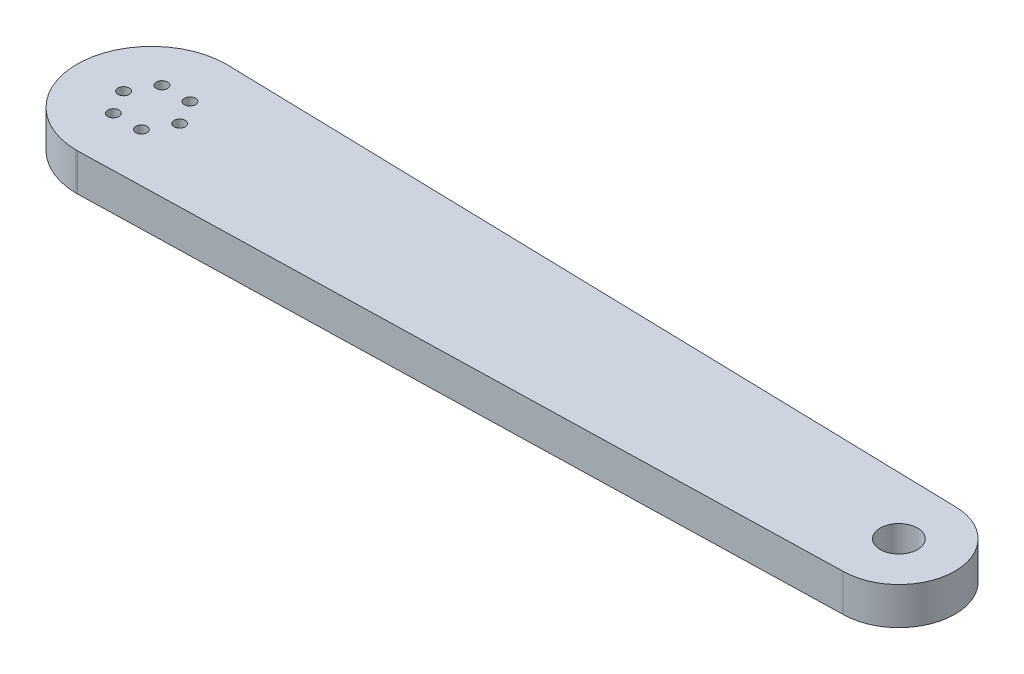
ISO-10303-21;
HEADER;
FILE_DESCRIPTION(('STEP AP214'),'2;1');
FILE_NAME('part.step','',(''),(''),'','','');
FILE_SCHEMA(('AUTOMOTIVE_DESIGN { 1 0 10303 214 1 1 1 1 }'));
ENDSEC;
DATA;
#1=APPLICATION_CONTEXT('core data for automotive mechanical design processes');
#2=APPLICATION_PROTOCOL_DEFINITION('international standard','automotive_design',2000,#1);
#3=PRODUCT_CONTEXT('',#1,'mechanical');
#4=PRODUCT('Part','Part','',(#3));
#5=PRODUCT_RELATED_PRODUCT_CATEGORY('part','',(#4));
#6=PRODUCT_DEFINITION_FORMATION('','',#4);
#7=PRODUCT_DEFINITION_CONTEXT('part definition',#1,'design');
#8=PRODUCT_DEFINITION('design','',#6,#7);
#9=PRODUCT_DEFINITION_SHAPE('','',#8);
#10=(LENGTH_UNIT() NAMED_UNIT(*) SI_UNIT(.MILLI.,.METRE.));
#11=(NAMED_UNIT(*) PLANE_ANGLE_UNIT() SI_UNIT($,.RADIAN.));
#12=(NAMED_UNIT(*) SI_UNIT($,.STERADIAN.) SOLID_ANGLE_UNIT());
#13=UNCERTAINTY_MEASURE_WITH_UNIT(LENGTH_MEASURE(1.E-05),#10,'distance_accuracy_value','');
#14=(GEOMETRIC_REPRESENTATION_CONTEXT(3) GLOBAL_UNCERTAINTY_ASSIGNED_CONTEXT((#13)) GLOBAL_UNIT_ASSIGNED_CONTEXT((#10,
#11,#12)) REPRESENTATION_CONTEXT('',''));
#15=CARTESIAN_POINT('',(0.,0.,0.));
#16=DIRECTION('',(0.,0.,1.));
#17=DIRECTION('',(1.,0.,0.));
#18=AXIS2_PLACEMENT_3D('',#15,#16,#17);
#19=CARTESIAN_POINT('',(-0.103539177595322,10.,9.99946396756861));
#20=DIRECTION('',(0.,-1.,0.));
#21=DIRECTION('',(0.,0.,-1.));
#22=AXIS2_PLACEMENT_3D('',#19,#20,#21);
#23=PLANE('',#22);
#24=CARTESIAN_POINT('',(-0.103539177595322,10.,9.99946396756861));
#25=DIRECTION('',(0.,1.,0.));
#26=DIRECTION('',(0.,0.,-1.));
#27=AXIS2_PLACEMENT_3D('',#24,#25,#26);
#28=CIRCLE('',#27,9.99999999999999);
#29=CARTESIAN_POINT('',(-0.207078355190655,10.,19.9989279351372));
#30=VERTEX_POINT('',#29);
#31=CARTESIAN_POINT('',(0.146382734006708,10.,19.9963404316498));
#32=VERTEX_POINT('',#31);
#33=EDGE_CURVE('E129',#30,#32,#28,.T.);
#34=ORIENTED_EDGE('',*,*,#33,.T.);
#35=DIRECTION('',(0.999687646408123,0.,-0.0249921911602031));
#36=VECTOR('',#35,1.);
#37=CARTESIAN_POINT('',(0.146382734006708,10.,19.9963404316498));
#38=LINE('',#37,#36);
#39=CARTESIAN_POINT('',(200.,10.,15.));
#40=VERTEX_POINT('',#39);
#41=EDGE_CURVE('E87',#32,#40,#38,.T.);
#42=ORIENTED_EDGE('',*,*,#41,.T.);
#43=CARTESIAN_POINT('',(200.,10.,0.));
#44=DIRECTION('',(0.,1.,0.));
#45=DIRECTION('',(0.,0.,1.));
#46=AXIS2_PLACEMENT_3D('',#43,#44,#45);
#47=CIRCLE('',#46,15.);
#48=CARTESIAN_POINT('',(200.,10.,-15.));
#49=VERTEX_POINT('',#48);
#50=EDGE_CURVE('E100',#40,#49,#47,.T.);
#51=ORIENTED_EDGE('',*,*,#50,.T.);
#52=DIRECTION('',(-0.999687646408123,0.,-0.0249921911602031));
#53=VECTOR('',#52,1.);
#54=CARTESIAN_POINT('',(0.146382734006708,10.,-19.9963404316498));
#55=LINE('',#54,#53);
#56=CARTESIAN_POINT('',(0.146382734006708,10.,-19.9963404316498));
#57=VERTEX_POINT('',#56);
#58=EDGE_CURVE('E94',#49,#57,#55,.T.);
#59=ORIENTED_EDGE('',*,*,#58,.T.);
#60=CARTESIAN_POINT('',(-0.103539177595322,10.,-9.99946396756861));
#61=DIRECTION('',(0.,1.,0.));
#62=DIRECTION('',(0.,0.,1.));
#63=AXIS2_PLACEMENT_3D('',#60,#61,#62);
#64=CIRCLE('',#63,9.99999999999999);
#65=CARTESIAN_POINT('',(-0.207078355190642,10.,-19.9989279351372));
#66=VERTEX_POINT('',#65);
#67=EDGE_CURVE('E98',#57,#66,#64,.T.);
#68=ORIENTED_EDGE('',*,*,#67,.T.);
#69=CARTESIAN_POINT('',(0.,10.,0.));
#70=DIRECTION('',(0.,1.,0.));
#71=DIRECTION('',(0.,0.,1.));
#72=AXIS2_PLACEMENT_3D('',#69,#70,#71);
#73=CIRCLE('',#72,20.);
#74=EDGE_CURVE('E50',#66,#30,#73,.T.);
#75=ORIENTED_EDGE('',*,*,#74,.T.);
#76=EDGE_LOOP('',(#34,#42,#51,#59,#68,#75));
#77=FACE_BOUND('',#76,.T.);
#78=CARTESIAN_POINT('',(7.5,10.,0.));
#79=DIRECTION('',(0.,1.,0.));
#80=DIRECTION('',(0.,0.,1.));
#81=AXIS2_PLACEMENT_3D('',#78,#79,#80);
#82=CIRCLE('',#81,1.5);
#83=CARTESIAN_POINT('',(7.5,10.,1.5));
#84=VERTEX_POINT('',#83);
#85=EDGE_CURVE('E122',#84,#84,#82,.T.);
#86=ORIENTED_EDGE('',*,*,#85,.F.);
#87=EDGE_LOOP('',(#86));
#88=FACE_BOUND('',#87,.T.);
#89=CARTESIAN_POINT('',(200.,10.,0.));
#90=DIRECTION('',(0.,1.,0.));
#91=DIRECTION('',(0.,0.,1.));
#92=AXIS2_PLACEMENT_3D('',#89,#90,#91);
#93=CIRCLE('',#92,4.99999999999999);
#94=CARTESIAN_POINT('',(200.,10.,4.99999999999999));
#95=VERTEX_POINT('',#94);
#96=EDGE_CURVE('E223',#95,#95,#93,.T.);
#97=ORIENTED_EDGE('',*,*,#96,.F.);
#98=EDGE_LOOP('',(#97));
#99=FACE_BOUND('',#98,.T.);
#100=CARTESIAN_POINT('',(3.74999999999998,10.,6.4951905283833));
#101=DIRECTION('',(0.,1.,0.));
#102=DIRECTION('',(0.,0.,1.));
#103=AXIS2_PLACEMENT_3D('',#100,#101,#102);
#104=CIRCLE('',#103,1.5);
#105=CARTESIAN_POINT('',(3.74999999999998,10.,7.9951905283833));
#106=VERTEX_POINT('',#105);
#107=EDGE_CURVE('E217',#106,#106,#104,.T.);
#108=ORIENTED_EDGE('',*,*,#107,.F.);
#109=EDGE_LOOP('',(#108));
#110=FACE_BOUND('',#109,.T.);
#111=CARTESIAN_POINT('',(-3.75000000000003,10.,6.49519052838327));
#112=DIRECTION('',(0.,1.,0.));
#113=DIRECTION('',(0.,0.,1.));
#114=AXIS2_PLACEMENT_3D('',#111,#112,#113);
#115=CIRCLE('',#114,1.5);
#116=CARTESIAN_POINT('',(-3.75000000000003,10.,7.99519052838327));
#117=VERTEX_POINT('',#116);
#118=EDGE_CURVE('E211',#117,#117,#115,.T.);
#119=ORIENTED_EDGE('',*,*,#118,.F.);
#120=EDGE_LOOP('',(#119));
#121=FACE_BOUND('',#120,.T.);
#122=CARTESIAN_POINT('',(-7.5,10.,0.));
#123=DIRECTION('',(0.,1.,0.));
#124=DIRECTION('',(0.,0.,1.));
#125=AXIS2_PLACEMENT_3D('',#122,#123,#124);
#126=CIRCLE('',#125,1.5);
#127=CARTESIAN_POINT('',(-7.5,10.,1.49999999999995));
#128=VERTEX_POINT('',#127);
#129=EDGE_CURVE('E205',#128,#128,#126,.T.);
#130=ORIENTED_EDGE('',*,*,#129,.F.);
#131=EDGE_LOOP('',(#130));
#132=FACE_BOUND('',#131,.T.);
#133=CARTESIAN_POINT('',(-3.74999999999994,10.,-6.49519052838333));
#134=DIRECTION('',(0.,1.,0.));
#135=DIRECTION('',(0.,0.,1.));
#136=AXIS2_PLACEMENT_3D('',#133,#134,#135);
#137=CIRCLE('',#136,1.5);
#138=CARTESIAN_POINT('',(-3.74999999999994,10.,-4.99519052838333));
#139=VERTEX_POINT('',#138);
#140=EDGE_CURVE('E199',#139,#139,#137,.T.);
#141=ORIENTED_EDGE('',*,*,#140,.F.);
#142=EDGE_LOOP('',(#141));
#143=FACE_BOUND('',#142,.T.);
#144=CARTESIAN_POINT('',(3.75000000000008,10.,-6.49519052838325));
#145=DIRECTION('',(0.,1.,0.));
#146=DIRECTION('',(0.,0.,1.));
#147=AXIS2_PLACEMENT_3D('',#144,#145,#146);
#148=CIRCLE('',#147,1.5);
#149=CARTESIAN_POINT('',(3.75000000000008,10.,-4.99519052838325));
#150=VERTEX_POINT('',#149);
#151=EDGE_CURVE('E190',#150,#150,#148,.T.);
#152=ORIENTED_EDGE('',*,*,#151,.F.);
#153=EDGE_LOOP('',(#152));
#154=FACE_BOUND('',#153,.T.);
#155=ADVANCED_FACE('F33',(#77,#88,#99,#110,#121,#132,#143,#154),#23,.F.);
#156=CARTESIAN_POINT('',(-0.103539177595322,0.,9.99946396756861));
#157=DIRECTION('',(0.,-1.,0.));
#158=DIRECTION('',(0.,0.,-1.));
#159=AXIS2_PLACEMENT_3D('',#156,#157,#158);
#160=PLANE('',#159);
#161=CARTESIAN_POINT('',(-3.74999999999994,0.,-6.49519052838333));
#162=DIRECTION('',(0.,1.,0.));
#163=DIRECTION('',(0.,0.,1.));
#164=AXIS2_PLACEMENT_3D('',#161,#162,#163);
#165=CIRCLE('',#164,1.5);
#166=CARTESIAN_POINT('',(-3.74999999999994,0.,-4.99519052838333));
#167=VERTEX_POINT('',#166);
#168=EDGE_CURVE('E196',#167,#167,#165,.T.);
#169=ORIENTED_EDGE('',*,*,#168,.T.);
#170=EDGE_LOOP('',(#169));
#171=FACE_BOUND('',#170,.T.);
#172=CARTESIAN_POINT('',(-3.75000000000003,0.,6.49519052838327));
#173=DIRECTION('',(0.,1.,0.));
#174=DIRECTION('',(0.,0.,1.));
#175=AXIS2_PLACEMENT_3D('',#172,#173,#174);
#176=CIRCLE('',#175,1.5);
#177=CARTESIAN_POINT('',(-3.75000000000003,0.,7.99519052838327));
#178=VERTEX_POINT('',#177);
#179=EDGE_CURVE('E208',#178,#178,#176,.T.);
#180=ORIENTED_EDGE('',*,*,#179,.T.);
#181=EDGE_LOOP('',(#180));
#182=FACE_BOUND('',#181,.T.);
#183=CARTESIAN_POINT('',(200.,0.,0.));
#184=DIRECTION('',(0.,1.,0.));
#185=DIRECTION('',(0.,0.,1.));
#186=AXIS2_PLACEMENT_3D('',#183,#184,#185);
#187=CIRCLE('',#186,4.99999999999999);
#188=CARTESIAN_POINT('',(200.,0.,4.99999999999999));
#189=VERTEX_POINT('',#188);
#190=EDGE_CURVE('E220',#189,#189,#187,.T.);
#191=ORIENTED_EDGE('',*,*,#190,.T.);
#192=EDGE_LOOP('',(#191));
#193=FACE_BOUND('',#192,.T.);
#194=CARTESIAN_POINT('',(-0.103539177595322,0.,9.99946396756861));
#195=DIRECTION('',(0.,1.,0.));
#196=DIRECTION('',(0.,0.,-1.));
#197=AXIS2_PLACEMENT_3D('',#194,#195,#196);
#198=CIRCLE('',#197,9.99999999999999);
#199=CARTESIAN_POINT('',(-0.207078355190655,0.,19.9989279351372));
#200=VERTEX_POINT('',#199);
#201=CARTESIAN_POINT('',(0.146382734006708,0.,19.9963404316498));
#202=VERTEX_POINT('',#201);
#203=EDGE_CURVE('E118',#200,#202,#198,.T.);
#204=ORIENTED_EDGE('',*,*,#203,.F.);
#205=CARTESIAN_POINT('',(0.,0.,0.));
#206=DIRECTION('',(0.,1.,0.));
#207=DIRECTION('',(0.,0.,1.));
#208=AXIS2_PLACEMENT_3D('',#205,#206,#207);
#209=CIRCLE('',#208,20.);
#210=CARTESIAN_POINT('',(-0.207078355190642,0.,-19.9989279351372));
#211=VERTEX_POINT('',#210);
#212=EDGE_CURVE('E79',#211,#200,#209,.T.);
#213=ORIENTED_EDGE('',*,*,#212,.F.);
#214=CARTESIAN_POINT('',(-0.103539177595322,0.,-9.99946396756861));
#215=DIRECTION('',(0.,1.,0.));
#216=DIRECTION('',(0.,0.,1.));
#217=AXIS2_PLACEMENT_3D('',#214,#215,#216);
#218=CIRCLE('',#217,9.99999999999999);
#219=CARTESIAN_POINT('',(0.146382734006708,0.,-19.9963404316498));
#220=VERTEX_POINT('',#219);
#221=EDGE_CURVE('E73',#220,#211,#218,.T.);
#222=ORIENTED_EDGE('',*,*,#221,.F.);
#223=DIRECTION('',(-0.999687646408123,0.,-0.0249921911602031));
#224=VECTOR('',#223,1.);
#225=CARTESIAN_POINT('',(0.146382734006708,0.,-19.9963404316498));
#226=LINE('',#225,#224);
#227=CARTESIAN_POINT('',(200.,0.,-15.));
#228=VERTEX_POINT('',#227);
#229=EDGE_CURVE('E108',#228,#220,#226,.T.);
#230=ORIENTED_EDGE('',*,*,#229,.F.);
#231=CARTESIAN_POINT('',(200.,0.,0.));
#232=DIRECTION('',(0.,1.,0.));
#233=DIRECTION('',(0.,0.,1.));
#234=AXIS2_PLACEMENT_3D('',#231,#232,#233);
#235=CIRCLE('',#234,15.);
#236=CARTESIAN_POINT('',(200.,0.,15.));
#237=VERTEX_POINT('',#236);
#238=EDGE_CURVE('E124',#237,#228,#235,.T.);
#239=ORIENTED_EDGE('',*,*,#238,.F.);
#240=DIRECTION('',(0.999687646408123,0.,-0.0249921911602031));
#241=VECTOR('',#240,1.);
#242=CARTESIAN_POINT('',(0.146382734006708,0.,19.9963404316498));
#243=LINE('',#242,#241);
#244=EDGE_CURVE('E121',#202,#237,#243,.T.);
#245=ORIENTED_EDGE('',*,*,#244,.F.);
#246=EDGE_LOOP('',(#204,#213,#222,#230,#239,#245));
#247=FACE_BOUND('',#246,.T.);
#248=CARTESIAN_POINT('',(7.5,0.,0.));
#249=DIRECTION('',(0.,1.,0.));
#250=DIRECTION('',(0.,0.,1.));
#251=AXIS2_PLACEMENT_3D('',#248,#249,#250);
#252=CIRCLE('',#251,1.5);
#253=CARTESIAN_POINT('',(7.5,0.,1.5));
#254=VERTEX_POINT('',#253);
#255=EDGE_CURVE('E226',#254,#254,#252,.T.);
#256=ORIENTED_EDGE('',*,*,#255,.T.);
#257=EDGE_LOOP('',(#256));
#258=FACE_BOUND('',#257,.T.);
#259=CARTESIAN_POINT('',(3.74999999999998,0.,6.4951905283833));
#260=DIRECTION('',(0.,1.,0.));
#261=DIRECTION('',(0.,0.,1.));
#262=AXIS2_PLACEMENT_3D('',#259,#260,#261);
#263=CIRCLE('',#262,1.5);
#264=CARTESIAN_POINT('',(3.74999999999998,0.,7.9951905283833));
#265=VERTEX_POINT('',#264);
#266=EDGE_CURVE('E214',#265,#265,#263,.T.);
#267=ORIENTED_EDGE('',*,*,#266,.T.);
#268=EDGE_LOOP('',(#267));
#269=FACE_BOUND('',#268,.T.);
#270=CARTESIAN_POINT('',(-7.5,0.,0.));
#271=DIRECTION('',(0.,1.,0.));
#272=DIRECTION('',(0.,0.,1.));
#273=AXIS2_PLACEMENT_3D('',#270,#271,#272);
#274=CIRCLE('',#273,1.5);
#275=CARTESIAN_POINT('',(-7.5,0.,1.49999999999995));
#276=VERTEX_POINT('',#275);
#277=EDGE_CURVE('E202',#276,#276,#274,.T.);
#278=ORIENTED_EDGE('',*,*,#277,.T.);
#279=EDGE_LOOP('',(#278));
#280=FACE_BOUND('',#279,.T.);
#281=CARTESIAN_POINT('',(3.75000000000008,0.,-6.49519052838325));
#282=DIRECTION('',(0.,1.,0.));
#283=DIRECTION('',(0.,0.,1.));
#284=AXIS2_PLACEMENT_3D('',#281,#282,#283);
#285=CIRCLE('',#284,1.5);
#286=CARTESIAN_POINT('',(3.75000000000008,0.,-4.99519052838325));
#287=VERTEX_POINT('',#286);
#288=EDGE_CURVE('E193',#287,#287,#285,.T.);
#289=ORIENTED_EDGE('',*,*,#288,.T.);
#290=EDGE_LOOP('',(#289));
#291=FACE_BOUND('',#290,.T.);
#292=ADVANCED_FACE('F138',(#171,#182,#193,#247,#258,#269,#280,#291),#160,.T.);
#293=CARTESIAN_POINT('',(-0.103539177595322,10.,9.99946396756861));
#294=DIRECTION('',(0.,-1.,0.));
#295=DIRECTION('',(0.,0.,-1.));
#296=AXIS2_PLACEMENT_3D('',#293,#294,#295);
#297=CYLINDRICAL_SURFACE('',#296,9.99999999999999);
#298=ORIENTED_EDGE('',*,*,#203,.T.);
#299=DIRECTION('',(0.,-1.,0.));
#300=VECTOR('',#299,1.);
#301=CARTESIAN_POINT('',(0.146382734006708,10.,19.9963404316498));
#302=LINE('',#301,#300);
#303=EDGE_CURVE('E11',#32,#202,#302,.T.);
#304=ORIENTED_EDGE('',*,*,#303,.F.);
#305=ORIENTED_EDGE('',*,*,#33,.F.);
#306=DIRECTION('',(0.,-1.,0.));
#307=VECTOR('',#306,1.);
#308=CARTESIAN_POINT('',(-0.207078355190655,10.,19.9989279351372));
#309=LINE('',#308,#307);
#310=EDGE_CURVE('E114',#30,#200,#309,.T.);
#311=ORIENTED_EDGE('',*,*,#310,.T.);
#312=EDGE_LOOP('',(#298,#304,#305,#311));
#313=FACE_BOUND('',#312,.T.);
#314=ADVANCED_FACE('F35',(#313),#297,.T.);
#315=CARTESIAN_POINT('',(0.146382734006708,10.,19.9963404316498));
#316=DIRECTION('',(-0.0249921911602031,0.,-0.999687646408123));
#317=DIRECTION('',(-0.999687646408123,0.,0.0249921911602031));
#318=AXIS2_PLACEMENT_3D('',#315,#316,#317);
#319=PLANE('',#318);
#320=ORIENTED_EDGE('',*,*,#244,.T.);
#321=DIRECTION('',(0.,-1.,0.));
#322=VECTOR('',#321,1.);
#323=CARTESIAN_POINT('',(200.,10.,15.));
#324=LINE('',#323,#322);
#325=EDGE_CURVE('E42',#40,#237,#324,.T.);
#326=ORIENTED_EDGE('',*,*,#325,.F.);
#327=ORIENTED_EDGE('',*,*,#41,.F.);
#328=ORIENTED_EDGE('',*,*,#303,.T.);
#329=EDGE_LOOP('',(#320,#326,#327,#328));
#330=FACE_BOUND('',#329,.T.);
#331=ADVANCED_FACE('F313',(#330),#319,.F.);
#332=CARTESIAN_POINT('',(200.,10.,0.));
#333=DIRECTION('',(0.,-1.,0.));
#334=DIRECTION('',(0.,0.,-1.));
#335=AXIS2_PLACEMENT_3D('',#332,#333,#334);
#336=CYLINDRICAL_SURFACE('',#335,15.);
#337=ORIENTED_EDGE('',*,*,#238,.T.);
#338=DIRECTION('',(0.,-1.,0.));
#339=VECTOR('',#338,1.);
#340=CARTESIAN_POINT('',(200.,10.,-15.));
#341=LINE('',#340,#339);
#342=EDGE_CURVE('E109',#49,#228,#341,.T.);
#343=ORIENTED_EDGE('',*,*,#342,.F.);
#344=ORIENTED_EDGE('',*,*,#50,.F.);
#345=ORIENTED_EDGE('',*,*,#325,.T.);
#346=EDGE_LOOP('',(#337,#343,#344,#345));
#347=FACE_BOUND('',#346,.T.);
#348=ADVANCED_FACE('F135',(#347),#336,.T.);
#349=CARTESIAN_POINT('',(0.146382734006708,10.,-19.9963404316498));
#350=DIRECTION('',(-0.0249921911602031,0.,0.999687646408123));
#351=DIRECTION('',(0.999687646408123,0.,0.0249921911602031));
#352=AXIS2_PLACEMENT_3D('',#349,#350,#351);
#353=PLANE('',#352);
#354=ORIENTED_EDGE('',*,*,#229,.T.);
#355=DIRECTION('',(0.,-1.,0.));
#356=VECTOR('',#355,1.);
#357=CARTESIAN_POINT('',(0.146382734006708,10.,-19.9963404316498));
#358=LINE('',#357,#356);
#359=EDGE_CURVE('E105',#57,#220,#358,.T.);
#360=ORIENTED_EDGE('',*,*,#359,.F.);
#361=ORIENTED_EDGE('',*,*,#58,.F.);
#362=ORIENTED_EDGE('',*,*,#342,.T.);
#363=EDGE_LOOP('',(#354,#360,#361,#362));
#364=FACE_BOUND('',#363,.T.);
#365=ADVANCED_FACE('F106',(#364),#353,.F.);
#366=CARTESIAN_POINT('',(-0.103539177595322,10.,-9.99946396756861));
#367=DIRECTION('',(0.,-1.,0.));
#368=DIRECTION('',(0.,0.,-1.));
#369=AXIS2_PLACEMENT_3D('',#366,#367,#368);
#370=CYLINDRICAL_SURFACE('',#369,9.99999999999999);
#371=ORIENTED_EDGE('',*,*,#221,.T.);
#372=DIRECTION('',(0.,-1.,0.));
#373=VECTOR('',#372,1.);
#374=CARTESIAN_POINT('',(-0.207078355190642,10.,-19.9989279351372));
#375=LINE('',#374,#373);
#376=EDGE_CURVE('E110',#66,#211,#375,.T.);
#377=ORIENTED_EDGE('',*,*,#376,.F.);
#378=ORIENTED_EDGE('',*,*,#67,.F.);
#379=ORIENTED_EDGE('',*,*,#359,.T.);
#380=EDGE_LOOP('',(#371,#377,#378,#379));
#381=FACE_BOUND('',#380,.T.);
#382=ADVANCED_FACE('F112',(#381),#370,.T.);
#383=CARTESIAN_POINT('',(0.,10.,0.));
#384=DIRECTION('',(0.,-1.,0.));
#385=DIRECTION('',(0.,0.,-1.));
#386=AXIS2_PLACEMENT_3D('',#383,#384,#385);
#387=CYLINDRICAL_SURFACE('',#386,20.);
#388=ORIENTED_EDGE('',*,*,#212,.T.);
#389=ORIENTED_EDGE('',*,*,#310,.F.);
#390=ORIENTED_EDGE('',*,*,#74,.F.);
#391=ORIENTED_EDGE('',*,*,#376,.T.);
#392=EDGE_LOOP('',(#388,#389,#390,#391));
#393=FACE_BOUND('',#392,.T.);
#394=ADVANCED_FACE('F143',(#393),#387,.T.);
#395=CARTESIAN_POINT('',(7.5,10.,0.));
#396=DIRECTION('',(0.,-1.,0.));
#397=DIRECTION('',(0.,0.,-1.));
#398=AXIS2_PLACEMENT_3D('',#395,#396,#397);
#399=CYLINDRICAL_SURFACE('',#398,1.5);
#400=ORIENTED_EDGE('',*,*,#85,.T.);
#401=EDGE_LOOP('',(#400));
#402=FACE_BOUND('',#401,.T.);
#403=ORIENTED_EDGE('',*,*,#255,.F.);
#404=EDGE_LOOP('',(#403));
#405=FACE_BOUND('',#404,.T.);
#406=ADVANCED_FACE('F145',(#402,#405),#399,.F.);
#407=CARTESIAN_POINT('',(200.,10.,0.));
#408=DIRECTION('',(0.,-1.,0.));
#409=DIRECTION('',(0.,0.,-1.));
#410=AXIS2_PLACEMENT_3D('',#407,#408,#409);
#411=CYLINDRICAL_SURFACE('',#410,4.99999999999999);
#412=ORIENTED_EDGE('',*,*,#96,.T.);
#413=EDGE_LOOP('',(#412));
#414=FACE_BOUND('',#413,.T.);
#415=ORIENTED_EDGE('',*,*,#190,.F.);
#416=EDGE_LOOP('',(#415));
#417=FACE_BOUND('',#416,.T.);
#418=ADVANCED_FACE('F151',(#414,#417),#411,.F.);
#419=CARTESIAN_POINT('',(3.74999999999998,10.,6.4951905283833));
#420=DIRECTION('',(0.,-1.,0.));
#421=DIRECTION('',(0.,0.,-1.));
#422=AXIS2_PLACEMENT_3D('',#419,#420,#421);
#423=CYLINDRICAL_SURFACE('',#422,1.5);
#424=ORIENTED_EDGE('',*,*,#107,.T.);
#425=EDGE_LOOP('',(#424));
#426=FACE_BOUND('',#425,.T.);
#427=ORIENTED_EDGE('',*,*,#266,.F.);
#428=EDGE_LOOP('',(#427));
#429=FACE_BOUND('',#428,.T.);
#430=ADVANCED_FACE('F165',(#426,#429),#423,.F.);
#431=CARTESIAN_POINT('',(-3.75000000000003,10.,6.49519052838327));
#432=DIRECTION('',(0.,-1.,0.));
#433=DIRECTION('',(0.,0.,-1.));
#434=AXIS2_PLACEMENT_3D('',#431,#432,#433);
#435=CYLINDRICAL_SURFACE('',#434,1.5);
#436=ORIENTED_EDGE('',*,*,#118,.T.);
#437=EDGE_LOOP('',(#436));
#438=FACE_BOUND('',#437,.T.);
#439=ORIENTED_EDGE('',*,*,#179,.F.);
#440=EDGE_LOOP('',(#439));
#441=FACE_BOUND('',#440,.T.);
#442=ADVANCED_FACE('F169',(#438,#441),#435,.F.);
#443=CARTESIAN_POINT('',(-7.5,10.,0.));
#444=DIRECTION('',(0.,-1.,0.));
#445=DIRECTION('',(0.,0.,-1.));
#446=AXIS2_PLACEMENT_3D('',#443,#444,#445);
#447=CYLINDRICAL_SURFACE('',#446,1.5);
#448=ORIENTED_EDGE('',*,*,#129,.T.);
#449=EDGE_LOOP('',(#448));
#450=FACE_BOUND('',#449,.T.);
#451=ORIENTED_EDGE('',*,*,#277,.F.);
#452=EDGE_LOOP('',(#451));
#453=FACE_BOUND('',#452,.T.);
#454=ADVANCED_FACE('F173',(#450,#453),#447,.F.);
#455=CARTESIAN_POINT('',(-3.74999999999994,10.,-6.49519052838333));
#456=DIRECTION('',(0.,-1.,0.));
#457=DIRECTION('',(0.,0.,-1.));
#458=AXIS2_PLACEMENT_3D('',#455,#456,#457);
#459=CYLINDRICAL_SURFACE('',#458,1.5);
#460=ORIENTED_EDGE('',*,*,#140,.T.);
#461=EDGE_LOOP('',(#460));
#462=FACE_BOUND('',#461,.T.);
#463=ORIENTED_EDGE('',*,*,#168,.F.);
#464=EDGE_LOOP('',(#463));
#465=FACE_BOUND('',#464,.T.);
#466=ADVANCED_FACE('F177',(#462,#465),#459,.F.);
#467=CARTESIAN_POINT('',(3.75000000000008,10.,-6.49519052838325));
#468=DIRECTION('',(0.,-1.,0.));
#469=DIRECTION('',(0.,0.,-1.));
#470=AXIS2_PLACEMENT_3D('',#467,#468,#469);
#471=CYLINDRICAL_SURFACE('',#470,1.5);
#472=ORIENTED_EDGE('',*,*,#151,.T.);
#473=EDGE_LOOP('',(#472));
#474=FACE_BOUND('',#473,.T.);
#475=ORIENTED_EDGE('',*,*,#288,.F.);
#476=EDGE_LOOP('',(#475));
#477=FACE_BOUND('',#476,.T.);
#478=ADVANCED_FACE('F181',(#474,#477),#471,.F.);
#479=CLOSED_SHELL('',(#155,#292,#314,#331,#348,#365,#382,#394,#406,#418,#430,#442,#454,#466,#478));
#480=MANIFOLD_SOLID_BREP('B2',#479);
#481=ADVANCED_BREP_SHAPE_REPRESENTATION('',(#18,#480),#14);
#482=SHAPE_DEFINITION_REPRESENTATION(#9,#481);
ENDSEC;
END-ISO-10303-21;
